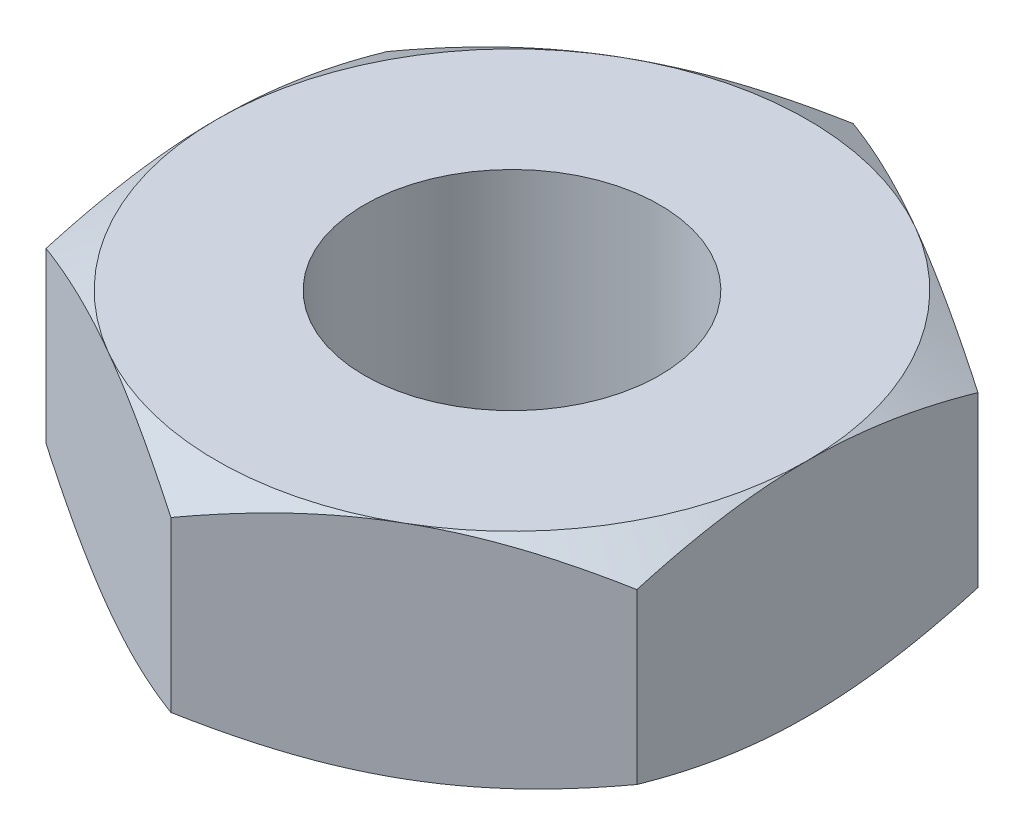
ISO-10303-21;
HEADER;
FILE_DESCRIPTION(('STEP AP214'),'2;1');
FILE_NAME('part.step','',(''),(''),'','','');
FILE_SCHEMA(('AUTOMOTIVE_DESIGN { 1 0 10303 214 1 1 1 1 }'));
ENDSEC;
DATA;
#1=APPLICATION_CONTEXT('core data for automotive mechanical design processes');
#2=APPLICATION_PROTOCOL_DEFINITION('international standard','automotive_design',2000,#1);
#3=PRODUCT_CONTEXT('',#1,'mechanical');
#4=PRODUCT('Part','Part','',(#3));
#5=PRODUCT_RELATED_PRODUCT_CATEGORY('part','',(#4));
#6=PRODUCT_DEFINITION_FORMATION('','',#4);
#7=PRODUCT_DEFINITION_CONTEXT('part definition',#1,'design');
#8=PRODUCT_DEFINITION('design','',#6,#7);
#9=PRODUCT_DEFINITION_SHAPE('','',#8);
#10=(LENGTH_UNIT() NAMED_UNIT(*) SI_UNIT(.MILLI.,.METRE.));
#11=(NAMED_UNIT(*) PLANE_ANGLE_UNIT() SI_UNIT($,.RADIAN.));
#12=(NAMED_UNIT(*) SI_UNIT($,.STERADIAN.) SOLID_ANGLE_UNIT());
#13=UNCERTAINTY_MEASURE_WITH_UNIT(LENGTH_MEASURE(1.E-05),#10,'distance_accuracy_value','');
#14=(GEOMETRIC_REPRESENTATION_CONTEXT(3) GLOBAL_UNCERTAINTY_ASSIGNED_CONTEXT((#13)) GLOBAL_UNIT_ASSIGNED_CONTEXT((#10,
#11,#12)) REPRESENTATION_CONTEXT('',''));
#15=CARTESIAN_POINT('',(0.,0.,0.));
#16=DIRECTION('',(0.,0.,1.));
#17=DIRECTION('',(1.,0.,0.));
#18=AXIS2_PLACEMENT_3D('',#15,#16,#17);
#19=CARTESIAN_POINT('',(-2.,1.5,1.15470053837925));
#20=DIRECTION('',(0.5,0.,-0.866025403784439));
#21=DIRECTION('',(-0.866025403784439,0.,-0.5));
#22=AXIS2_PLACEMENT_3D('',#19,#20,#21);
#23=PLANE('',#22);
#24=CARTESIAN_POINT('',(0.000200000000000871,0.178699466620498,2.30951654681234));
#25=CARTESIAN_POINT('',(-0.0876912629000591,0.149389536100679,2.25877250251758));
#26=CARTESIAN_POINT('',(-0.17634119447359,0.122732851980467,2.20759044065996));
#27=CARTESIAN_POINT('',(-0.355176246997801,0.0762024910207211,2.10433997494456));
#28=CARTESIAN_POINT('',(-0.445364546505036,0.0563452763827791,2.05226973594631));
#29=CARTESIAN_POINT('',(-0.624623385763305,0.0254334640232527,1.94877459684592));
#30=CARTESIAN_POINT('',(-0.713666338226303,0.0141731515985314,1.89736562427197));
#31=CARTESIAN_POINT('',(-0.892171397785042,0.000728662594642178,1.79430568008402));
#32=CARTESIAN_POINT('',(-0.981632855703957,-0.00146664504653163,1.74265508327244));
#33=CARTESIAN_POINT('',(-1.1488083535488,0.00309098933064886,1.64613626458981));
#34=CARTESIAN_POINT('',(-1.22654737026578,0.00872487468701465,1.60125362236173));
#35=CARTESIAN_POINT('',(-1.38151891453613,0.0265838952608284,1.51178075956051));
#36=CARTESIAN_POINT('',(-1.4587509057412,0.0388151360234394,1.46719084864821));
#37=CARTESIAN_POINT('',(-1.6140421864822,0.0693934368676098,1.37753338590959));
#38=CARTESIAN_POINT('',(-1.69208181310738,0.0878701670657158,1.33247718647009));
#39=CARTESIAN_POINT('',(-1.84699686569213,0.129805518212856,1.24303693915875));
#40=CARTESIAN_POINT('',(-1.92387427762312,0.153254280492313,1.1986517446858));
#41=CARTESIAN_POINT('',(-2.0002,0.178699466620498,1.15458506832541));
#42=B_SPLINE_CURVE_WITH_KNOTS('',3,(#24,#25,#26,#27,#28,#29,#30,#31,#32,#33,#34,#35,#36,#37,#38,
#39,#40,#41),.UNSPECIFIED.,.F.,.F.,(4,2,2,2,2,2,2,2,4),(0.,0.31703182469561,0.634825876346563,
0.944753967652636,1.25430138000371,1.52387047293094,1.79368946861028,2.06949491027634,
2.34475850821472),.UNSPECIFIED.);
#43=CARTESIAN_POINT('',(0.,0.178632794954081,2.3094010767585));
#44=VERTEX_POINT('',#43);
#45=CARTESIAN_POINT('',(-1.,0.,1.73205080756888));
#46=VERTEX_POINT('',#45);
#47=EDGE_CURVE('E143',#44,#46,#42,.T.);
#48=ORIENTED_EDGE('',*,*,#47,.F.);
#49=DIRECTION('',(0.,-1.,0.));
#50=VECTOR('',#49,1.);
#51=CARTESIAN_POINT('',(0.,1.5,2.3094010767585));
#52=LINE('',#51,#50);
#53=CARTESIAN_POINT('',(0.,1.32136720504592,2.3094010767585));
#54=VERTEX_POINT('',#53);
#55=EDGE_CURVE('E155',#54,#44,#52,.T.);
#56=ORIENTED_EDGE('',*,*,#55,.F.);
#57=CARTESIAN_POINT('',(-2.0002,1.3213005333795,1.15458506832541));
#58=CARTESIAN_POINT('',(-1.91230873709994,1.35061046389932,1.20532911262018));
#59=CARTESIAN_POINT('',(-1.82365880552641,1.37726714801953,1.2565111744778));
#60=CARTESIAN_POINT('',(-1.6448237530022,1.42379750897928,1.35976164019319));
#61=CARTESIAN_POINT('',(-1.55463545349496,1.44365472361722,1.41183187919145));
#62=CARTESIAN_POINT('',(-1.37537661423669,1.47456653597675,1.51532701829183));
#63=CARTESIAN_POINT('',(-1.2863336617737,1.48582684840147,1.56673599086578));
#64=CARTESIAN_POINT('',(-1.10782860221496,1.49927133740536,1.66979593505373));
#65=CARTESIAN_POINT('',(-1.01836714429604,1.50146664504653,1.72144653186531));
#66=CARTESIAN_POINT('',(-0.851191646451202,1.49690901066935,1.81796535054794));
#67=CARTESIAN_POINT('',(-0.773452629734216,1.49127512531299,1.86284799277603));
#68=CARTESIAN_POINT('',(-0.618481085463867,1.47341610473917,1.95232085557725));
#69=CARTESIAN_POINT('',(-0.541249094258801,1.46118486397656,1.99691076648954));
#70=CARTESIAN_POINT('',(-0.385957813517799,1.43060656313239,2.08656822922816));
#71=CARTESIAN_POINT('',(-0.30791818689262,1.41212983293428,2.13162442866767));
#72=CARTESIAN_POINT('',(-0.153003134307864,1.37019448178714,2.221064675979));
#73=CARTESIAN_POINT('',(-0.076125722376879,1.34674571950769,2.26544987045196));
#74=CARTESIAN_POINT('',(0.00020000000000098,1.3213005333795,2.30951654681234));
#75=B_SPLINE_CURVE_WITH_KNOTS('',3,(#57,#58,#59,#60,#61,#62,#63,#64,#65,#66,#67,#68,#69,#70,#71,
#72,#73,#74),.UNSPECIFIED.,.F.,.F.,(4,2,2,2,2,2,2,2,4),(0.,0.31703182469561,0.634825876346564,
0.944753967652636,1.25430138000371,1.52387047293094,1.79368946861028,2.06949491027634,
2.34475850821472),.UNSPECIFIED.);
#76=CARTESIAN_POINT('',(-1.,1.5,1.73205080756888));
#77=VERTEX_POINT('',#76);
#78=EDGE_CURVE('E315',#77,#54,#75,.T.);
#79=ORIENTED_EDGE('',*,*,#78,.F.);
#80=CARTESIAN_POINT('',(-2.,1.32136720504593,1.15470053837926));
#81=VERTEX_POINT('',#80);
#82=EDGE_CURVE('E307',#81,#77,#75,.T.);
#83=ORIENTED_EDGE('',*,*,#82,.F.);
#84=DIRECTION('',(0.,-1.,0.));
#85=VECTOR('',#84,1.);
#86=CARTESIAN_POINT('',(-2.,1.5,1.15470053837925));
#87=LINE('',#86,#85);
#88=CARTESIAN_POINT('',(-2.,0.178632794954081,1.15470053837925));
#89=VERTEX_POINT('',#88);
#90=EDGE_CURVE('E240',#81,#89,#87,.T.);
#91=ORIENTED_EDGE('',*,*,#90,.T.);
#92=EDGE_CURVE('E206',#46,#89,#42,.T.);
#93=ORIENTED_EDGE('',*,*,#92,.F.);
#94=EDGE_LOOP('',(#48,#56,#79,#83,#91,#93));
#95=FACE_BOUND('',#94,.T.);
#96=ADVANCED_FACE('F35',(#95),#23,.F.);
#97=CARTESIAN_POINT('',(0.,1.5,2.3094010767585));
#98=DIRECTION('',(-0.5,0.,-0.866025403784439));
#99=DIRECTION('',(-0.866025403784439,0.,0.5));
#100=AXIS2_PLACEMENT_3D('',#97,#98,#99);
#101=PLANE('',#100);
#102=CARTESIAN_POINT('',(2.0002,0.178699466620498,1.15458506832541));
#103=CARTESIAN_POINT('',(1.91230873709994,0.149389536100679,1.20532911262018));
#104=CARTESIAN_POINT('',(1.82365880552641,0.122732851980467,1.2565111744778));
#105=CARTESIAN_POINT('',(1.6448237530022,0.0762024910207213,1.35976164019319));
#106=CARTESIAN_POINT('',(1.55463545349496,0.0563452763827795,1.41183187919145));
#107=CARTESIAN_POINT('',(1.37537661423669,0.025433464023253,1.51532701829183));
#108=CARTESIAN_POINT('',(1.2863336617737,0.0141731515985316,1.56673599086578));
#109=CARTESIAN_POINT('',(1.10782860221496,0.000728662594642367,1.66979593505373));
#110=CARTESIAN_POINT('',(1.01836714429604,-0.00146664504653124,1.72144653186531));
#111=CARTESIAN_POINT('',(0.851191646451202,0.00309098933064935,1.81796535054794));
#112=CARTESIAN_POINT('',(0.773452629734216,0.00872487468701508,1.86284799277603));
#113=CARTESIAN_POINT('',(0.618481085463867,0.0265838952608287,1.95232085557725));
#114=CARTESIAN_POINT('',(0.541249094258802,0.0388151360234396,1.99691076648954));
#115=CARTESIAN_POINT('',(0.385957813517799,0.0693934368676101,2.08656822922816));
#116=CARTESIAN_POINT('',(0.307918186892621,0.0878701670657163,2.13162442866767));
#117=CARTESIAN_POINT('',(0.153003134307866,0.129805518212856,2.221064675979));
#118=CARTESIAN_POINT('',(0.0761257223768805,0.153254280492314,2.26544987045196));
#119=CARTESIAN_POINT('',(-0.000199999999999435,0.178699466620498,2.30951654681234));
#120=B_SPLINE_CURVE_WITH_KNOTS('',3,(#102,#103,#104,#105,#106,#107,#108,#109,#110,#111,#112,
#113,#114,#115,#116,#117,#118,#119),.UNSPECIFIED.,.F.,.F.,(4,2,2,2,2,2,2,2,4),(0.,
0.31703182469561,0.634825876346563,0.944753967652636,1.25430138000371,1.52387047293094,
1.79368946861028,2.06949491027634,2.34475850821472),.UNSPECIFIED.);
#121=CARTESIAN_POINT('',(2.,0.178632794954081,1.15470053837925));
#122=VERTEX_POINT('',#121);
#123=CARTESIAN_POINT('',(1.,0.,1.73205080756888));
#124=VERTEX_POINT('',#123);
#125=EDGE_CURVE('E124',#122,#124,#120,.T.);
#126=ORIENTED_EDGE('',*,*,#125,.F.);
#127=DIRECTION('',(0.,-1.,0.));
#128=VECTOR('',#127,1.);
#129=CARTESIAN_POINT('',(2.,1.5,1.15470053837925));
#130=LINE('',#129,#128);
#131=CARTESIAN_POINT('',(2.,1.32136720504592,1.15470053837925));
#132=VERTEX_POINT('',#131);
#133=EDGE_CURVE('E237',#132,#122,#130,.T.);
#134=ORIENTED_EDGE('',*,*,#133,.F.);
#135=CARTESIAN_POINT('',(-0.000199999999999203,1.3213005333795,2.30951654681234));
#136=CARTESIAN_POINT('',(0.0876912629000609,1.35061046389932,2.25877250251758));
#137=CARTESIAN_POINT('',(0.176341194473592,1.37726714801953,2.20759044065996));
#138=CARTESIAN_POINT('',(0.355176246997803,1.42379750897928,2.10433997494456));
#139=CARTESIAN_POINT('',(0.445364546505037,1.44365472361722,2.0522697359463));
#140=CARTESIAN_POINT('',(0.624623385763307,1.47456653597675,1.94877459684592));
#141=CARTESIAN_POINT('',(0.713666338226305,1.48582684840147,1.89736562427197));
#142=CARTESIAN_POINT('',(0.892171397785044,1.49927133740536,1.79430568008402));
#143=CARTESIAN_POINT('',(0.981632855703959,1.50146664504653,1.74265508327244));
#144=CARTESIAN_POINT('',(1.1488083535488,1.49690901066935,1.64613626458981));
#145=CARTESIAN_POINT('',(1.22654737026578,1.49127512531299,1.60125362236173));
#146=CARTESIAN_POINT('',(1.38151891453613,1.47341610473917,1.51178075956051));
#147=CARTESIAN_POINT('',(1.4587509057412,1.46118486397656,1.46719084864821));
#148=CARTESIAN_POINT('',(1.6140421864822,1.43060656313239,1.37753338590959));
#149=CARTESIAN_POINT('',(1.69208181310738,1.41212983293428,1.33247718647009));
#150=CARTESIAN_POINT('',(1.84699686569214,1.37019448178714,1.24303693915875));
#151=CARTESIAN_POINT('',(1.92387427762312,1.34674571950769,1.1986517446858));
#152=CARTESIAN_POINT('',(2.0002,1.3213005333795,1.15458506832541));
#153=B_SPLINE_CURVE_WITH_KNOTS('',3,(#135,#136,#137,#138,#139,#140,#141,#142,#143,#144,#145,
#146,#147,#148,#149,#150,#151,#152),.UNSPECIFIED.,.F.,.F.,(4,2,2,2,2,2,2,2,4),(0.,
0.31703182469561,0.634825876346563,0.944753967652635,1.25430138000371,1.52387047293094,
1.79368946861028,2.06949491027634,2.34475850821472),.UNSPECIFIED.);
#154=CARTESIAN_POINT('',(1.,1.5,1.73205080756888));
#155=VERTEX_POINT('',#154);
#156=EDGE_CURVE('E283',#155,#132,#153,.T.);
#157=ORIENTED_EDGE('',*,*,#156,.F.);
#158=EDGE_CURVE('E320',#54,#155,#153,.T.);
#159=ORIENTED_EDGE('',*,*,#158,.F.);
#160=ORIENTED_EDGE('',*,*,#55,.T.);
#161=EDGE_CURVE('E136',#124,#44,#120,.T.);
#162=ORIENTED_EDGE('',*,*,#161,.F.);
#163=EDGE_LOOP('',(#126,#134,#157,#159,#160,#162));
#164=FACE_BOUND('',#163,.T.);
#165=ADVANCED_FACE('F152',(#164),#101,.F.);
#166=CARTESIAN_POINT('',(2.,1.5,1.15470053837925));
#167=DIRECTION('',(-1.,0.,0.));
#168=DIRECTION('',(0.,0.,1.));
#169=AXIS2_PLACEMENT_3D('',#166,#167,#168);
#170=PLANE('',#169);
#171=CARTESIAN_POINT('',(2.,1.38024356206322,-3.9086858120223));
#172=CARTESIAN_POINT('',(2.,1.33338477520942,-3.81751112169324));
#173=CARTESIAN_POINT('',(2.,1.28679021631781,-3.72620145046507));
#174=CARTESIAN_POINT('',(2.,1.19424910626193,-3.54325228824929));
#175=CARTESIAN_POINT('',(2.,1.14830256761152,-3.45161279093522));
#176=CARTESIAN_POINT('',(2.,1.01146715761723,-3.17581300243889));
#177=CARTESIAN_POINT('',(2.,0.921737415753043,-2.9910709203634));
#178=CARTESIAN_POINT('',(2.,0.788409395654004,-2.70743624323685));
#179=CARTESIAN_POINT('',(2.,0.743100656319978,-2.60934831774002));
#180=CARTESIAN_POINT('',(2.,0.654163775473776,-2.41241507533712));
#181=CARTESIAN_POINT('',(2.,0.610535569794256,-2.31356978752232));
#182=CARTESIAN_POINT('',(2.,0.525465312630819,-2.11501734395706));
#183=CARTESIAN_POINT('',(2.,0.484021797433511,-2.0153108187193));
#184=CARTESIAN_POINT('',(2.,0.403937006613858,-1.81474539793162));
#185=CARTESIAN_POINT('',(2.,0.365296392668009,-1.71388623674348));
#186=CARTESIAN_POINT('',(2.,0.285617620657406,-1.49400593807688));
#187=CARTESIAN_POINT('',(2.,0.245241020544741,-1.37474151517002));
#188=CARTESIAN_POINT('',(2.,0.171425178991217,-1.13410850020832));
#189=CARTESIAN_POINT('',(2.,0.137982386760639,-1.0127410198025));
#190=CARTESIAN_POINT('',(2.,0.0810163135177482,-0.770071934944817));
#191=CARTESIAN_POINT('',(2.,0.05731644498316,-0.648812992268316));
#192=CARTESIAN_POINT('',(2.,0.0214266196550796,-0.404608758962328));
#193=CARTESIAN_POINT('',(2.,0.00922997508793481,-0.281664490388411));
#194=CARTESIAN_POINT('',(2.,-0.00207085477321442,-0.0335419748269816));
#195=CARTESIAN_POINT('',(2.,-0.00100267071105186,0.0916445286709641));
#196=CARTESIAN_POINT('',(2.,0.0144840452379088,0.341193409529));
#197=CARTESIAN_POINT('',(2.,0.0289073543713881,0.465555475947226));
#198=CARTESIAN_POINT('',(2.,0.0695474304125028,0.714833183390077));
#199=CARTESIAN_POINT('',(2.,0.0959955839540991,0.83970964218488));
#200=CARTESIAN_POINT('',(2.,0.157986894429597,1.08715459095749));
#201=CARTESIAN_POINT('',(2.,0.193532661864587,1.20972240762972));
#202=CARTESIAN_POINT('',(2.,0.269280519283634,1.44650470413582));
#203=CARTESIAN_POINT('',(2.,0.309153182000627,1.56082665519536));
#204=CARTESIAN_POINT('',(2.,0.393292544621002,1.78785420479763));
#205=CARTESIAN_POINT('',(2.,0.437560254612616,1.90055942493322));
#206=CARTESIAN_POINT('',(2.,0.529372373860236,2.12474648121528));
#207=CARTESIAN_POINT('',(2.,0.576919977737398,2.23622699843601));
#208=CARTESIAN_POINT('',(2.,0.67443498494533,2.45812606854002));
#209=CARTESIAN_POINT('',(2.,0.724402516378927,2.56854456483181));
#210=CARTESIAN_POINT('',(2.,0.823331957292792,2.78238975570627));
#211=CARTESIAN_POINT('',(2.,0.872194314459439,2.88586269009034));
#212=CARTESIAN_POINT('',(2.,0.971202074310625,3.09219555395058));
#213=CARTESIAN_POINT('',(2.,1.02134751719606,3.19505546409504));
#214=CARTESIAN_POINT('',(2.,1.12249261908677,3.39994809054478));
#215=CARTESIAN_POINT('',(2.,1.1734890679984,3.50198239517474));
#216=CARTESIAN_POINT('',(2.,1.27629914354312,3.70562803087648));
#217=CARTESIAN_POINT('',(2.,1.32811270118693,3.80723939675145));
#218=CARTESIAN_POINT('',(2.,1.38024356206323,3.9086858120223));
#219=B_SPLINE_CURVE_WITH_KNOTS('',3,(#171,#172,#173,#174,#175,#176,#177,#178,#179,#180,#181,
#182,#183,#184,#185,#186,#187,#188,#189,#190,#191,#192,#193,#194,#195,#196,#197,#198,#199,#200,
#201,#202,#203,#204,#205,#206,#207,#208,#209,#210,#211,#212,#213,#214,#215,#216,#217,#218),
.UNSPECIFIED.,.F.,.F.,(4,2,2,2,2,2,2,2,2,2,2,2,2,2,2,2,2,2,2,2,2,2,2,4),(0.,0.307531563856155,
0.615069058317578,1.23115557383005,1.55528461857819,1.8794012749051,2.2032979430231,
2.52727082574405,2.9048604545366,3.28225624019068,3.65247322929853,4.02247484779028,
4.39728941630346,4.77223811112903,5.15472880172826,5.53732936883045,5.90044039858863,
6.26363507408059,6.62718863760779,6.99076146751935,7.33404016464889,7.67732963038956,
8.01953135999518,8.36170435024385),.UNSPECIFIED.);
#220=CARTESIAN_POINT('',(2.,0.178632794954081,-1.15470053837925));
#221=VERTEX_POINT('',#220);
#222=CARTESIAN_POINT('',(2.,0.,0.));
#223=VERTEX_POINT('',#222);
#224=EDGE_CURVE('E51',#221,#223,#219,.T.);
#225=ORIENTED_EDGE('',*,*,#224,.F.);
#226=DIRECTION('',(0.,-1.,0.));
#227=VECTOR('',#226,1.);
#228=CARTESIAN_POINT('',(2.,1.5,-1.15470053837925));
#229=LINE('',#228,#227);
#230=CARTESIAN_POINT('',(2.,1.32136720504592,-1.15470053837925));
#231=VERTEX_POINT('',#230);
#232=EDGE_CURVE('E234',#231,#221,#229,.T.);
#233=ORIENTED_EDGE('',*,*,#232,.F.);
#234=CARTESIAN_POINT('',(2.,0.119756437936775,3.9086858120223));
#235=CARTESIAN_POINT('',(2.,0.166615224790584,3.81751112169324));
#236=CARTESIAN_POINT('',(2.,0.213209783682193,3.72620145046507));
#237=CARTESIAN_POINT('',(2.,0.305750893738074,3.54325228824929));
#238=CARTESIAN_POINT('',(2.,0.351697432388484,3.45161279093522));
#239=CARTESIAN_POINT('',(2.,0.488532842382774,3.17581300243889));
#240=CARTESIAN_POINT('',(2.,0.578262584246956,2.9910709203634));
#241=CARTESIAN_POINT('',(2.,0.711590604345995,2.70743624323685));
#242=CARTESIAN_POINT('',(2.,0.756899343680022,2.60934831774002));
#243=CARTESIAN_POINT('',(2.,0.845836224526223,2.41241507533712));
#244=CARTESIAN_POINT('',(2.,0.889464430205743,2.31356978752232));
#245=CARTESIAN_POINT('',(2.,0.974534687369181,2.11501734395706));
#246=CARTESIAN_POINT('',(2.,1.01597820256649,2.0153108187193));
#247=CARTESIAN_POINT('',(2.,1.09606299338614,1.81474539793162));
#248=CARTESIAN_POINT('',(2.,1.13470360733199,1.71388623674348));
#249=CARTESIAN_POINT('',(2.,1.21438237934259,1.49400593807688));
#250=CARTESIAN_POINT('',(2.,1.25475897945526,1.37474151517002));
#251=CARTESIAN_POINT('',(2.,1.32857482100878,1.13410850020832));
#252=CARTESIAN_POINT('',(2.,1.36201761323936,1.0127410198025));
#253=CARTESIAN_POINT('',(2.,1.41898368648225,0.770071934944817));
#254=CARTESIAN_POINT('',(2.,1.44268355501684,0.648812992268316));
#255=CARTESIAN_POINT('',(2.,1.47857338034492,0.404608758962328));
#256=CARTESIAN_POINT('',(2.,1.49077002491207,0.281664490388411));
#257=CARTESIAN_POINT('',(2.,1.50207085477321,0.033541974826982));
#258=CARTESIAN_POINT('',(2.,1.50100267071105,-0.0916445286709635));
#259=CARTESIAN_POINT('',(2.,1.48551595476209,-0.341193409528999));
#260=CARTESIAN_POINT('',(2.,1.47109264562861,-0.465555475947226));
#261=CARTESIAN_POINT('',(2.,1.4304525695875,-0.714833183390076));
#262=CARTESIAN_POINT('',(2.,1.4040044160459,-0.83970964218488));
#263=CARTESIAN_POINT('',(2.,1.3420131055704,-1.08715459095749));
#264=CARTESIAN_POINT('',(2.,1.30646733813541,-1.20972240762972));
#265=CARTESIAN_POINT('',(2.,1.23071948071637,-1.44650470413582));
#266=CARTESIAN_POINT('',(2.,1.19084681799937,-1.56082665519536));
#267=CARTESIAN_POINT('',(2.,1.106707455379,-1.78785420479763));
#268=CARTESIAN_POINT('',(2.,1.06243974538738,-1.90055942493322));
#269=CARTESIAN_POINT('',(2.,0.970627626139765,-2.12474648121528));
#270=CARTESIAN_POINT('',(2.,0.923080022262602,-2.23622699843601));
#271=CARTESIAN_POINT('',(2.,0.82556501505467,-2.45812606854002));
#272=CARTESIAN_POINT('',(2.,0.775597483621073,-2.56854456483181));
#273=CARTESIAN_POINT('',(2.,0.676668042707208,-2.78238975570627));
#274=CARTESIAN_POINT('',(2.,0.627805685540561,-2.88586269009034));
#275=CARTESIAN_POINT('',(2.,0.528797925689376,-3.09219555395058));
#276=CARTESIAN_POINT('',(2.,0.478652482803938,-3.19505546409504));
#277=CARTESIAN_POINT('',(2.,0.377507380913227,-3.39994809054478));
#278=CARTESIAN_POINT('',(2.,0.326510932001602,-3.50198239517474));
#279=CARTESIAN_POINT('',(2.,0.223700856456886,-3.70562803087648));
#280=CARTESIAN_POINT('',(2.,0.17188729881307,-3.80723939675145));
#281=CARTESIAN_POINT('',(2.,0.119756437936776,-3.9086858120223));
#282=B_SPLINE_CURVE_WITH_KNOTS('',3,(#234,#235,#236,#237,#238,#239,#240,#241,#242,#243,#244,
#245,#246,#247,#248,#249,#250,#251,#252,#253,#254,#255,#256,#257,#258,#259,#260,#261,#262,#263,
#264,#265,#266,#267,#268,#269,#270,#271,#272,#273,#274,#275,#276,#277,#278,#279,#280,#281),
.UNSPECIFIED.,.F.,.F.,(4,2,2,2,2,2,2,2,2,2,2,2,2,2,2,2,2,2,2,2,2,2,2,4),(0.,0.307531563856155,
0.615069058317577,1.23115557383005,1.55528461857819,1.8794012749051,2.20329794302309,
2.52727082574405,2.9048604545366,3.28225624019068,3.65247322929853,4.02247484779028,
4.39728941630346,4.77223811112902,5.15472880172826,5.53732936883045,5.90044039858862,
6.26363507408059,6.62718863760779,6.99076146751934,7.33404016464889,7.67732963038956,
8.01953135999517,8.36170435024385),.UNSPECIFIED.);
#283=CARTESIAN_POINT('',(2.,1.5,0.));
#284=VERTEX_POINT('',#283);
#285=EDGE_CURVE('E276',#284,#231,#282,.T.);
#286=ORIENTED_EDGE('',*,*,#285,.F.);
#287=EDGE_CURVE('E282',#132,#284,#282,.T.);
#288=ORIENTED_EDGE('',*,*,#287,.F.);
#289=ORIENTED_EDGE('',*,*,#133,.T.);
#290=EDGE_CURVE('E130',#223,#122,#219,.T.);
#291=ORIENTED_EDGE('',*,*,#290,.F.);
#292=EDGE_LOOP('',(#225,#233,#286,#288,#289,#291));
#293=FACE_BOUND('',#292,.T.);
#294=ADVANCED_FACE('F289',(#293),#170,.F.);
#295=CARTESIAN_POINT('',(2.,1.5,-1.15470053837925));
#296=DIRECTION('',(-0.5,0.,0.866025403784439));
#297=DIRECTION('',(0.866025403784439,0.,0.5));
#298=AXIS2_PLACEMENT_3D('',#295,#296,#297);
#299=PLANE('',#298);
#300=CARTESIAN_POINT('',(-0.000200000000000425,0.178699466620497,-2.30951654681234));
#301=CARTESIAN_POINT('',(0.0876912629000599,0.149389536100679,-2.25877250251757));
#302=CARTESIAN_POINT('',(0.176341194473591,0.122732851980467,-2.20759044065995));
#303=CARTESIAN_POINT('',(0.355176246997802,0.0762024910207208,-2.10433997494456));
#304=CARTESIAN_POINT('',(0.445364546505036,0.0563452763827789,-2.0522697359463));
#305=CARTESIAN_POINT('',(0.624623385763306,0.0254334640232524,-1.94877459684592));
#306=CARTESIAN_POINT('',(0.713666338226304,0.0141731515985312,-1.89736562427197));
#307=CARTESIAN_POINT('',(0.892171397785043,0.000728662594642122,-1.79430568008402));
#308=CARTESIAN_POINT('',(0.981632855703957,-0.00146664504653161,-1.74265508327244));
#309=CARTESIAN_POINT('',(1.1488083535488,0.00309098933064879,-1.64613626458981));
#310=CARTESIAN_POINT('',(1.22654737026578,0.00872487468701445,-1.60125362236173));
#311=CARTESIAN_POINT('',(1.38151891453613,0.0265838952608282,-1.51178075956051));
#312=CARTESIAN_POINT('',(1.4587509057412,0.0388151360234393,-1.46719084864821));
#313=CARTESIAN_POINT('',(1.6140421864822,0.0693934368676098,-1.37753338590959));
#314=CARTESIAN_POINT('',(1.69208181310738,0.0878701670657158,-1.33247718647009));
#315=CARTESIAN_POINT('',(1.84699686569213,0.129805518212856,-1.24303693915875));
#316=CARTESIAN_POINT('',(1.92387427762312,0.153254280492313,-1.1986517446858));
#317=CARTESIAN_POINT('',(2.0002,0.178699466620497,-1.15458506832541));
#318=B_SPLINE_CURVE_WITH_KNOTS('',3,(#300,#301,#302,#303,#304,#305,#306,#307,#308,#309,#310,
#311,#312,#313,#314,#315,#316,#317),.UNSPECIFIED.,.F.,.F.,(4,2,2,2,2,2,2,2,4),(0.,
0.31703182469561,0.634825876346563,0.944753967652636,1.25430138000371,1.52387047293094,
1.79368946861028,2.06949491027634,2.34475850821472),.UNSPECIFIED.);
#319=CARTESIAN_POINT('',(0.,0.17863279495408,-2.3094010767585));
#320=VERTEX_POINT('',#319);
#321=CARTESIAN_POINT('',(0.999999999999999,0.,-1.73205080756888));
#322=VERTEX_POINT('',#321);
#323=EDGE_CURVE('E58',#320,#322,#318,.T.);
#324=ORIENTED_EDGE('',*,*,#323,.F.);
#325=DIRECTION('',(0.,-1.,0.));
#326=VECTOR('',#325,1.);
#327=CARTESIAN_POINT('',(0.,1.5,-2.3094010767585));
#328=LINE('',#327,#326);
#329=CARTESIAN_POINT('',(0.,1.32136720504592,-2.3094010767585));
#330=VERTEX_POINT('',#329);
#331=EDGE_CURVE('E227',#330,#320,#328,.T.);
#332=ORIENTED_EDGE('',*,*,#331,.F.);
#333=CARTESIAN_POINT('',(2.0002,1.3213005333795,-1.15458506832541));
#334=CARTESIAN_POINT('',(1.91230873709994,1.35061046389932,-1.20532911262018));
#335=CARTESIAN_POINT('',(1.82365880552641,1.37726714801953,-1.2565111744778));
#336=CARTESIAN_POINT('',(1.6448237530022,1.42379750897928,-1.35976164019319));
#337=CARTESIAN_POINT('',(1.55463545349496,1.44365472361722,-1.41183187919145));
#338=CARTESIAN_POINT('',(1.37537661423669,1.47456653597675,-1.51532701829183));
#339=CARTESIAN_POINT('',(1.2863336617737,1.48582684840147,-1.56673599086578));
#340=CARTESIAN_POINT('',(1.10782860221496,1.49927133740536,-1.66979593505373));
#341=CARTESIAN_POINT('',(1.01836714429604,1.50146664504653,-1.72144653186531));
#342=CARTESIAN_POINT('',(0.851191646451201,1.49690901066935,-1.81796535054794));
#343=CARTESIAN_POINT('',(0.773452629734216,1.49127512531299,-1.86284799277603));
#344=CARTESIAN_POINT('',(0.618481085463866,1.47341610473917,-1.95232085557725));
#345=CARTESIAN_POINT('',(0.541249094258801,1.46118486397656,-1.99691076648954));
#346=CARTESIAN_POINT('',(0.385957813517799,1.43060656313239,-2.08656822922816));
#347=CARTESIAN_POINT('',(0.30791818689262,1.41212983293428,-2.13162442866767));
#348=CARTESIAN_POINT('',(0.153003134307865,1.37019448178714,-2.221064675979));
#349=CARTESIAN_POINT('',(0.0761257223768797,1.34674571950769,-2.26544987045196));
#350=CARTESIAN_POINT('',(-0.000200000000000532,1.3213005333795,-2.30951654681234));
#351=B_SPLINE_CURVE_WITH_KNOTS('',3,(#333,#334,#335,#336,#337,#338,#339,#340,#341,#342,#343,
#344,#345,#346,#347,#348,#349,#350),.UNSPECIFIED.,.F.,.F.,(4,2,2,2,2,2,2,2,4),(0.,
0.31703182469561,0.634825876346563,0.944753967652636,1.25430138000371,1.52387047293094,
1.79368946861028,2.06949491027634,2.34475850821472),.UNSPECIFIED.);
#352=CARTESIAN_POINT('',(0.999999999999999,1.5,-1.73205080756888));
#353=VERTEX_POINT('',#352);
#354=EDGE_CURVE('E269',#353,#330,#351,.T.);
#355=ORIENTED_EDGE('',*,*,#354,.F.);
#356=EDGE_CURVE('E275',#231,#353,#351,.T.);
#357=ORIENTED_EDGE('',*,*,#356,.F.);
#358=ORIENTED_EDGE('',*,*,#232,.T.);
#359=EDGE_CURVE('E135',#322,#221,#318,.T.);
#360=ORIENTED_EDGE('',*,*,#359,.F.);
#361=EDGE_LOOP('',(#324,#332,#355,#357,#358,#360));
#362=FACE_BOUND('',#361,.T.);
#363=ADVANCED_FACE('F225',(#362),#299,.F.);
#364=CARTESIAN_POINT('',(0.,1.5,-2.3094010767585));
#365=DIRECTION('',(0.5,0.,0.866025403784439));
#366=DIRECTION('',(0.866025403784439,0.,-0.5));
#367=AXIS2_PLACEMENT_3D('',#364,#365,#366);
#368=PLANE('',#367);
#369=CARTESIAN_POINT('',(-2.0002,0.178699466620498,-1.15458506832541));
#370=CARTESIAN_POINT('',(-1.91230873709994,0.149389536100679,-1.20532911262018));
#371=CARTESIAN_POINT('',(-1.82365880552641,0.122732851980467,-1.2565111744778));
#372=CARTESIAN_POINT('',(-1.6448237530022,0.0762024910207211,-1.35976164019319));
#373=CARTESIAN_POINT('',(-1.55463545349496,0.0563452763827792,-1.41183187919145));
#374=CARTESIAN_POINT('',(-1.37537661423669,0.0254334640232525,-1.51532701829183));
#375=CARTESIAN_POINT('',(-1.2863336617737,0.0141731515985311,-1.56673599086578));
#376=CARTESIAN_POINT('',(-1.10782860221496,0.000728662594641959,-1.66979593505373));
#377=CARTESIAN_POINT('',(-1.01836714429604,-0.00146664504653162,-1.72144653186531));
#378=CARTESIAN_POINT('',(-0.851191646451202,0.0030909893306488,-1.81796535054794));
#379=CARTESIAN_POINT('',(-0.773452629734217,0.00872487468701436,-1.86284799277603));
#380=CARTESIAN_POINT('',(-0.618481085463867,0.0265838952608281,-1.95232085557725));
#381=CARTESIAN_POINT('',(-0.541249094258802,0.0388151360234392,-1.99691076648954));
#382=CARTESIAN_POINT('',(-0.3859578135178,0.0693934368676098,-2.08656822922816));
#383=CARTESIAN_POINT('',(-0.307918186892621,0.0878701670657157,-2.13162442866767));
#384=CARTESIAN_POINT('',(-0.153003134307866,0.129805518212855,-2.221064675979));
#385=CARTESIAN_POINT('',(-0.0761257223768802,0.153254280492313,-2.26544987045196));
#386=CARTESIAN_POINT('',(0.000199999999999784,0.178699466620497,-2.30951654681234));
#387=B_SPLINE_CURVE_WITH_KNOTS('',3,(#369,#370,#371,#372,#373,#374,#375,#376,#377,#378,#379,
#380,#381,#382,#383,#384,#385,#386),.UNSPECIFIED.,.F.,.F.,(4,2,2,2,2,2,2,2,4),(0.,
0.31703182469561,0.634825876346563,0.944753967652636,1.25430138000371,1.52387047293094,
1.79368946861028,2.06949491027634,2.34475850821472),.UNSPECIFIED.);
#388=CARTESIAN_POINT('',(-2.,0.178632794954074,-1.15470053837926));
#389=VERTEX_POINT('',#388);
#390=CARTESIAN_POINT('',(-1.,0.,-1.73205080756888));
#391=VERTEX_POINT('',#390);
#392=EDGE_CURVE('E200',#389,#391,#387,.T.);
#393=ORIENTED_EDGE('',*,*,#392,.F.);
#394=DIRECTION('',(0.,-1.,0.));
#395=VECTOR('',#394,1.);
#396=CARTESIAN_POINT('',(-2.,1.5,-1.15470053837925));
#397=LINE('',#396,#395);
#398=CARTESIAN_POINT('',(-2.,1.32136720504592,-1.15470053837925));
#399=VERTEX_POINT('',#398);
#400=EDGE_CURVE('E235',#399,#389,#397,.T.);
#401=ORIENTED_EDGE('',*,*,#400,.F.);
#402=CARTESIAN_POINT('',(0.000199999999999613,1.3213005333795,-2.30951654681234));
#403=CARTESIAN_POINT('',(-0.0876912629000601,1.35061046389932,-2.25877250251757));
#404=CARTESIAN_POINT('',(-0.176341194473592,1.37726714801953,-2.20759044065995));
#405=CARTESIAN_POINT('',(-0.355176246997802,1.42379750897928,-2.10433997494456));
#406=CARTESIAN_POINT('',(-0.445364546505037,1.44365472361722,-2.0522697359463));
#407=CARTESIAN_POINT('',(-0.624623385763306,1.47456653597675,-1.94877459684592));
#408=CARTESIAN_POINT('',(-0.713666338226304,1.48582684840147,-1.89736562427197));
#409=CARTESIAN_POINT('',(-0.892171397785043,1.49927133740536,-1.79430568008402));
#410=CARTESIAN_POINT('',(-0.981632855703958,1.50146664504653,-1.74265508327244));
#411=CARTESIAN_POINT('',(-1.1488083535488,1.49690901066935,-1.64613626458981));
#412=CARTESIAN_POINT('',(-1.22654737026578,1.49127512531299,-1.60125362236172));
#413=CARTESIAN_POINT('',(-1.38151891453613,1.47341610473917,-1.51178075956051));
#414=CARTESIAN_POINT('',(-1.4587509057412,1.46118486397656,-1.46719084864821));
#415=CARTESIAN_POINT('',(-1.6140421864822,1.43060656313239,-1.37753338590959));
#416=CARTESIAN_POINT('',(-1.69208181310738,1.41212983293428,-1.33247718647009));
#417=CARTESIAN_POINT('',(-1.84699686569214,1.37019448178714,-1.24303693915875));
#418=CARTESIAN_POINT('',(-1.92387427762312,1.34674571950769,-1.1986517446858));
#419=CARTESIAN_POINT('',(-2.0002,1.3213005333795,-1.15458506832541));
#420=B_SPLINE_CURVE_WITH_KNOTS('',3,(#402,#403,#404,#405,#406,#407,#408,#409,#410,#411,#412,
#413,#414,#415,#416,#417,#418,#419),.UNSPECIFIED.,.F.,.F.,(4,2,2,2,2,2,2,2,4),(0.,
0.31703182469561,0.634825876346563,0.944753967652635,1.25430138000371,1.52387047293094,
1.79368946861028,2.06949491027634,2.34475850821472),.UNSPECIFIED.);
#421=CARTESIAN_POINT('',(-1.,1.5,-1.73205080756888));
#422=VERTEX_POINT('',#421);
#423=EDGE_CURVE('E262',#422,#399,#420,.T.);
#424=ORIENTED_EDGE('',*,*,#423,.F.);
#425=EDGE_CURVE('E233',#330,#422,#420,.T.);
#426=ORIENTED_EDGE('',*,*,#425,.F.);
#427=ORIENTED_EDGE('',*,*,#331,.T.);
#428=EDGE_CURVE('E156',#391,#320,#387,.T.);
#429=ORIENTED_EDGE('',*,*,#428,.F.);
#430=EDGE_LOOP('',(#393,#401,#424,#426,#427,#429));
#431=FACE_BOUND('',#430,.T.);
#432=ADVANCED_FACE('F230',(#431),#368,.F.);
#433=CARTESIAN_POINT('',(-2.,1.5,-1.15470053837925));
#434=DIRECTION('',(1.,0.,0.));
#435=DIRECTION('',(0.,0.,-1.));
#436=AXIS2_PLACEMENT_3D('',#433,#434,#435);
#437=PLANE('',#436);
#438=CARTESIAN_POINT('',(-2.,1.38024356206322,3.9086858120223));
#439=CARTESIAN_POINT('',(-2.,1.33338477520941,3.81751112169324));
#440=CARTESIAN_POINT('',(-2.,1.28679021631781,3.72620145046507));
#441=CARTESIAN_POINT('',(-2.,1.19424910626193,3.54325228824929));
#442=CARTESIAN_POINT('',(-2.,1.14830256761152,3.45161279093522));
#443=CARTESIAN_POINT('',(-2.,1.01146715761723,3.17581300243889));
#444=CARTESIAN_POINT('',(-2.,0.921737415753043,2.9910709203634));
#445=CARTESIAN_POINT('',(-2.,0.788409395654004,2.70743624323685));
#446=CARTESIAN_POINT('',(-2.,0.743100656319978,2.60934831774002));
#447=CARTESIAN_POINT('',(-2.,0.654163775473776,2.41241507533712));
#448=CARTESIAN_POINT('',(-2.,0.610535569794256,2.31356978752231));
#449=CARTESIAN_POINT('',(-2.,0.525465312630819,2.11501734395706));
#450=CARTESIAN_POINT('',(-2.,0.484021797433511,2.0153108187193));
#451=CARTESIAN_POINT('',(-2.,0.403937006613858,1.81474539793162));
#452=CARTESIAN_POINT('',(-2.,0.365296392668009,1.71388623674347));
#453=CARTESIAN_POINT('',(-2.,0.285617620657406,1.49400593807688));
#454=CARTESIAN_POINT('',(-2.,0.245241020544741,1.37474151517002));
#455=CARTESIAN_POINT('',(-2.,0.171425178991217,1.13410850020832));
#456=CARTESIAN_POINT('',(-2.,0.137982386760639,1.0127410198025));
#457=CARTESIAN_POINT('',(-2.,0.0810163135177484,0.770071934944815));
#458=CARTESIAN_POINT('',(-2.,0.0573164449831603,0.648812992268314));
#459=CARTESIAN_POINT('',(-2.,0.0214266196550801,0.404608758962327));
#460=CARTESIAN_POINT('',(-2.,0.00922997508793534,0.28166449038841));
#461=CARTESIAN_POINT('',(-2.,-0.00207085477321389,0.0335419748269802));
#462=CARTESIAN_POINT('',(-2.,-0.0010026707110514,-0.0916445286709655));
#463=CARTESIAN_POINT('',(-2.,0.0144840452379092,-0.341193409529001));
#464=CARTESIAN_POINT('',(-2.,0.0289073543713886,-0.465555475947227));
#465=CARTESIAN_POINT('',(-2.,0.0695474304125032,-0.714833183390078));
#466=CARTESIAN_POINT('',(-2.,0.0959955839540996,-0.839709642184882));
#467=CARTESIAN_POINT('',(-2.,0.157986894429598,-1.08715459095749));
#468=CARTESIAN_POINT('',(-2.,0.193532661864587,-1.20972240762972));
#469=CARTESIAN_POINT('',(-2.,0.269280519283635,-1.44650470413582));
#470=CARTESIAN_POINT('',(-2.,0.309153182000627,-1.56082665519536));
#471=CARTESIAN_POINT('',(-2.,0.393292544621002,-1.78785420479763));
#472=CARTESIAN_POINT('',(-2.,0.437560254612616,-1.90055942493322));
#473=CARTESIAN_POINT('',(-2.,0.529372373860236,-2.12474648121528));
#474=CARTESIAN_POINT('',(-2.,0.576919977737398,-2.23622699843601));
#475=CARTESIAN_POINT('',(-2.,0.67443498494533,-2.45812606854002));
#476=CARTESIAN_POINT('',(-2.,0.724402516378928,-2.56854456483182));
#477=CARTESIAN_POINT('',(-2.,0.823331957292793,-2.78238975570627));
#478=CARTESIAN_POINT('',(-2.,0.872194314459439,-2.88586269009034));
#479=CARTESIAN_POINT('',(-2.,0.971202074310624,-3.09219555395058));
#480=CARTESIAN_POINT('',(-2.,1.02134751719606,-3.19505546409504));
#481=CARTESIAN_POINT('',(-2.,1.12249261908677,-3.39994809054477));
#482=CARTESIAN_POINT('',(-2.,1.1734890679984,-3.50198239517474));
#483=CARTESIAN_POINT('',(-2.,1.27629914354311,-3.70562803087648));
#484=CARTESIAN_POINT('',(-2.,1.32811270118693,-3.80723939675145));
#485=CARTESIAN_POINT('',(-2.,1.38024356206322,-3.9086858120223));
#486=B_SPLINE_CURVE_WITH_KNOTS('',3,(#438,#439,#440,#441,#442,#443,#444,#445,#446,#447,#448,
#449,#450,#451,#452,#453,#454,#455,#456,#457,#458,#459,#460,#461,#462,#463,#464,#465,#466,#467,
#468,#469,#470,#471,#472,#473,#474,#475,#476,#477,#478,#479,#480,#481,#482,#483,#484,#485),
.UNSPECIFIED.,.F.,.F.,(4,2,2,2,2,2,2,2,2,2,2,2,2,2,2,2,2,2,2,2,2,2,2,4),(0.,0.307531563856155,
0.615069058317577,1.23115557383004,1.55528461857819,1.8794012749051,2.20329794302309,
2.52727082574405,2.9048604545366,3.28225624019068,3.65247322929853,4.02247484779028,
4.39728941630346,4.77223811112902,5.15472880172826,5.53732936883045,5.90044039858863,
6.26363507408059,6.62718863760779,6.99076146751934,7.33404016464889,7.67732963038956,
8.01953135999517,8.36170435024385),.UNSPECIFIED.);
#487=CARTESIAN_POINT('',(-2.,0.,0.));
#488=VERTEX_POINT('',#487);
#489=EDGE_CURVE('E214',#89,#488,#486,.T.);
#490=ORIENTED_EDGE('',*,*,#489,.F.);
#491=ORIENTED_EDGE('',*,*,#90,.F.);
#492=CARTESIAN_POINT('',(-2.,0.119756437936777,-3.9086858120223));
#493=CARTESIAN_POINT('',(-2.,0.166615224790585,-3.81751112169324));
#494=CARTESIAN_POINT('',(-2.,0.213209783682194,-3.72620145046507));
#495=CARTESIAN_POINT('',(-2.,0.305750893738075,-3.54325228824929));
#496=CARTESIAN_POINT('',(-2.,0.351697432388485,-3.45161279093522));
#497=CARTESIAN_POINT('',(-2.,0.488532842382775,-3.17581300243889));
#498=CARTESIAN_POINT('',(-2.,0.578262584246957,-2.9910709203634));
#499=CARTESIAN_POINT('',(-2.,0.711590604345996,-2.70743624323685));
#500=CARTESIAN_POINT('',(-2.,0.756899343680022,-2.60934831774002));
#501=CARTESIAN_POINT('',(-2.,0.845836224526224,-2.41241507533712));
#502=CARTESIAN_POINT('',(-2.,0.889464430205744,-2.31356978752231));
#503=CARTESIAN_POINT('',(-2.,0.974534687369181,-2.11501734395706));
#504=CARTESIAN_POINT('',(-2.,1.01597820256649,-2.0153108187193));
#505=CARTESIAN_POINT('',(-2.,1.09606299338614,-1.81474539793162));
#506=CARTESIAN_POINT('',(-2.,1.13470360733199,-1.71388623674347));
#507=CARTESIAN_POINT('',(-2.,1.21438237934259,-1.49400593807688));
#508=CARTESIAN_POINT('',(-2.,1.25475897945526,-1.37474151517002));
#509=CARTESIAN_POINT('',(-2.,1.32857482100878,-1.13410850020832));
#510=CARTESIAN_POINT('',(-2.,1.36201761323936,-1.0127410198025));
#511=CARTESIAN_POINT('',(-2.,1.41898368648225,-0.770071934944816));
#512=CARTESIAN_POINT('',(-2.,1.44268355501684,-0.648812992268315));
#513=CARTESIAN_POINT('',(-2.,1.47857338034492,-0.404608758962327));
#514=CARTESIAN_POINT('',(-2.,1.49077002491206,-0.28166449038841));
#515=CARTESIAN_POINT('',(-2.,1.50207085477321,-0.0335419748269803));
#516=CARTESIAN_POINT('',(-2.,1.50100267071105,0.0916445286709655));
#517=CARTESIAN_POINT('',(-2.,1.48551595476209,0.341193409529001));
#518=CARTESIAN_POINT('',(-2.,1.47109264562861,0.465555475947227));
#519=CARTESIAN_POINT('',(-2.,1.4304525695875,0.714833183390078));
#520=CARTESIAN_POINT('',(-2.,1.4040044160459,0.839709642184882));
#521=CARTESIAN_POINT('',(-2.,1.3420131055704,1.08715459095749));
#522=CARTESIAN_POINT('',(-2.,1.30646733813541,1.20972240762972));
#523=CARTESIAN_POINT('',(-2.,1.23071948071637,1.44650470413582));
#524=CARTESIAN_POINT('',(-2.,1.19084681799937,1.56082665519536));
#525=CARTESIAN_POINT('',(-2.,1.106707455379,1.78785420479763));
#526=CARTESIAN_POINT('',(-2.,1.06243974538738,1.90055942493322));
#527=CARTESIAN_POINT('',(-2.,0.970627626139764,2.12474648121528));
#528=CARTESIAN_POINT('',(-2.,0.923080022262601,2.23622699843601));
#529=CARTESIAN_POINT('',(-2.,0.82556501505467,2.45812606854002));
#530=CARTESIAN_POINT('',(-2.,0.775597483621072,2.56854456483181));
#531=CARTESIAN_POINT('',(-2.,0.676668042707207,2.78238975570627));
#532=CARTESIAN_POINT('',(-2.,0.627805685540561,2.88586269009034));
#533=CARTESIAN_POINT('',(-2.,0.528797925689376,3.09219555395058));
#534=CARTESIAN_POINT('',(-2.,0.478652482803938,3.19505546409504));
#535=CARTESIAN_POINT('',(-2.,0.377507380913227,3.39994809054477));
#536=CARTESIAN_POINT('',(-2.,0.326510932001602,3.50198239517474));
#537=CARTESIAN_POINT('',(-2.,0.223700856456887,3.70562803087648));
#538=CARTESIAN_POINT('',(-2.,0.171887298813071,3.80723939675145));
#539=CARTESIAN_POINT('',(-2.,0.119756437936777,3.9086858120223));
#540=B_SPLINE_CURVE_WITH_KNOTS('',3,(#492,#493,#494,#495,#496,#497,#498,#499,#500,#501,#502,
#503,#504,#505,#506,#507,#508,#509,#510,#511,#512,#513,#514,#515,#516,#517,#518,#519,#520,#521,
#522,#523,#524,#525,#526,#527,#528,#529,#530,#531,#532,#533,#534,#535,#536,#537,#538,#539),
.UNSPECIFIED.,.F.,.F.,(4,2,2,2,2,2,2,2,2,2,2,2,2,2,2,2,2,2,2,2,2,2,2,4),(0.,0.307531563856155,
0.615069058317577,1.23115557383005,1.55528461857819,1.8794012749051,2.20329794302309,
2.52727082574405,2.9048604545366,3.28225624019068,3.65247322929853,4.02247484779028,
4.39728941630346,4.77223811112902,5.15472880172826,5.53732936883045,5.90044039858862,
6.26363507408059,6.62718863760779,6.99076146751934,7.33404016464888,7.67732963038955,
8.01953135999517,8.36170435024385),.UNSPECIFIED.);
#541=CARTESIAN_POINT('',(-2.,1.5,0.));
#542=VERTEX_POINT('',#541);
#543=EDGE_CURVE('E245',#542,#81,#540,.T.);
#544=ORIENTED_EDGE('',*,*,#543,.F.);
#545=EDGE_CURVE('E147',#399,#542,#540,.T.);
#546=ORIENTED_EDGE('',*,*,#545,.F.);
#547=ORIENTED_EDGE('',*,*,#400,.T.);
#548=EDGE_CURVE('E191',#488,#389,#486,.T.);
#549=ORIENTED_EDGE('',*,*,#548,.F.);
#550=EDGE_LOOP('',(#490,#491,#544,#546,#547,#549));
#551=FACE_BOUND('',#550,.T.);
#552=ADVANCED_FACE('F250',(#551),#437,.F.);
#553=CARTESIAN_POINT('',(0.,0.,0.));
#554=DIRECTION('',(0.,1.,0.));
#555=DIRECTION('',(0.,0.,1.));
#556=AXIS2_PLACEMENT_3D('',#553,#554,#555);
#557=PLANE('',#556);
#558=CARTESIAN_POINT('',(0.,0.,0.));
#559=DIRECTION('',(0.,1.,0.));
#560=DIRECTION('',(0.,0.,1.));
#561=AXIS2_PLACEMENT_3D('',#558,#559,#560);
#562=CIRCLE('',#561,1.);
#563=CARTESIAN_POINT('',(0.,0.,1.));
#564=VERTEX_POINT('',#563);
#565=EDGE_CURVE('E311',#564,#564,#562,.T.);
#566=ORIENTED_EDGE('',*,*,#565,.T.);
#567=EDGE_LOOP('',(#566));
#568=FACE_BOUND('',#567,.T.);
#569=CARTESIAN_POINT('',(0.,0.,0.));
#570=DIRECTION('',(0.,1.,0.));
#571=DIRECTION('',(0.,0.,1.));
#572=AXIS2_PLACEMENT_3D('',#569,#570,#571);
#573=CIRCLE('',#572,2.);
#574=EDGE_CURVE('E12',#124,#223,#573,.T.);
#575=ORIENTED_EDGE('',*,*,#574,.F.);
#576=EDGE_CURVE('E39',#46,#124,#573,.T.);
#577=ORIENTED_EDGE('',*,*,#576,.F.);
#578=EDGE_CURVE('E146',#488,#46,#573,.T.);
#579=ORIENTED_EDGE('',*,*,#578,.F.);
#580=EDGE_CURVE('E366',#391,#488,#573,.T.);
#581=ORIENTED_EDGE('',*,*,#580,.F.);
#582=EDGE_CURVE('E44',#322,#391,#573,.T.);
#583=ORIENTED_EDGE('',*,*,#582,.F.);
#584=CARTESIAN_POINT('',(0.,0.,0.));
#585=DIRECTION('',(0.,-1.,0.));
#586=DIRECTION('',(0.,0.,-1.));
#587=AXIS2_PLACEMENT_3D('',#584,#585,#586);
#588=CIRCLE('',#587,2.);
#589=EDGE_CURVE('E150',#322,#223,#588,.T.);
#590=ORIENTED_EDGE('',*,*,#589,.T.);
#591=EDGE_LOOP('',(#575,#577,#579,#581,#583,#590));
#592=FACE_BOUND('',#591,.T.);
#593=ADVANCED_FACE('F148',(#568,#592),#557,.F.);
#594=CARTESIAN_POINT('',(0.,1.5,0.));
#595=DIRECTION('',(0.,1.,0.));
#596=DIRECTION('',(0.,0.,1.));
#597=AXIS2_PLACEMENT_3D('',#594,#595,#596);
#598=PLANE('',#597);
#599=CARTESIAN_POINT('',(0.,1.5,0.));
#600=DIRECTION('',(0.,1.,0.));
#601=DIRECTION('',(0.,0.,1.));
#602=AXIS2_PLACEMENT_3D('',#599,#600,#601);
#603=CIRCLE('',#602,1.);
#604=CARTESIAN_POINT('',(0.,1.5,1.));
#605=VERTEX_POINT('',#604);
#606=EDGE_CURVE('E309',#605,#605,#603,.T.);
#607=ORIENTED_EDGE('',*,*,#606,.F.);
#608=EDGE_LOOP('',(#607));
#609=FACE_BOUND('',#608,.T.);
#610=CARTESIAN_POINT('',(0.,1.5,0.));
#611=DIRECTION('',(0.,1.,0.));
#612=DIRECTION('',(0.,0.,1.));
#613=AXIS2_PLACEMENT_3D('',#610,#611,#612);
#614=CIRCLE('',#613,2.);
#615=EDGE_CURVE('E341',#77,#155,#614,.T.);
#616=ORIENTED_EDGE('',*,*,#615,.T.);
#617=EDGE_CURVE('E268',#155,#284,#614,.T.);
#618=ORIENTED_EDGE('',*,*,#617,.T.);
#619=EDGE_CURVE('E339',#284,#353,#614,.T.);
#620=ORIENTED_EDGE('',*,*,#619,.T.);
#621=EDGE_CURVE('E342',#353,#422,#614,.T.);
#622=ORIENTED_EDGE('',*,*,#621,.T.);
#623=EDGE_CURVE('E344',#422,#542,#614,.T.);
#624=ORIENTED_EDGE('',*,*,#623,.T.);
#625=EDGE_CURVE('E343',#542,#77,#614,.T.);
#626=ORIENTED_EDGE('',*,*,#625,.T.);
#627=EDGE_LOOP('',(#616,#618,#620,#622,#624,#626));
#628=FACE_BOUND('',#627,.T.);
#629=ADVANCED_FACE('F337',(#609,#628),#598,.T.);
#630=CARTESIAN_POINT('',(0.,1.5,0.));
#631=DIRECTION('',(0.,-1.,0.));
#632=DIRECTION('',(0.,0.,-1.));
#633=AXIS2_PLACEMENT_3D('',#630,#631,#632);
#634=CYLINDRICAL_SURFACE('',#633,1.);
#635=ORIENTED_EDGE('',*,*,#606,.T.);
#636=EDGE_LOOP('',(#635));
#637=FACE_BOUND('',#636,.T.);
#638=ORIENTED_EDGE('',*,*,#565,.F.);
#639=EDGE_LOOP('',(#638));
#640=FACE_BOUND('',#639,.T.);
#641=ADVANCED_FACE('F477',(#637,#640),#634,.F.);
#642=CARTESIAN_POINT('',(0.,1.5,0.));
#643=DIRECTION('',(0.,-1.,0.));
#644=DIRECTION('',(0.,0.,1.));
#645=AXIS2_PLACEMENT_3D('',#642,#643,#644);
#646=CONICAL_SURFACE('',#645,2.,1.0471975511966);
#647=ORIENTED_EDGE('',*,*,#82,.T.);
#648=ORIENTED_EDGE('',*,*,#625,.F.);
#649=ORIENTED_EDGE('',*,*,#543,.T.);
#650=EDGE_LOOP('',(#647,#648,#649));
#651=FACE_BOUND('',#650,.T.);
#652=ADVANCED_FACE('F183',(#651),#646,.T.);
#653=ORIENTED_EDGE('',*,*,#423,.T.);
#654=ORIENTED_EDGE('',*,*,#545,.T.);
#655=ORIENTED_EDGE('',*,*,#623,.F.);
#656=EDGE_LOOP('',(#653,#654,#655));
#657=FACE_BOUND('',#656,.T.);
#658=ADVANCED_FACE('F353',(#657),#646,.T.);
#659=ORIENTED_EDGE('',*,*,#354,.T.);
#660=ORIENTED_EDGE('',*,*,#425,.T.);
#661=ORIENTED_EDGE('',*,*,#621,.F.);
#662=EDGE_LOOP('',(#659,#660,#661));
#663=FACE_BOUND('',#662,.T.);
#664=ADVANCED_FACE('F347',(#663),#646,.T.);
#665=ORIENTED_EDGE('',*,*,#285,.T.);
#666=ORIENTED_EDGE('',*,*,#356,.T.);
#667=ORIENTED_EDGE('',*,*,#619,.F.);
#668=EDGE_LOOP('',(#665,#666,#667));
#669=FACE_BOUND('',#668,.T.);
#670=ADVANCED_FACE('F345',(#669),#646,.T.);
#671=ORIENTED_EDGE('',*,*,#156,.T.);
#672=ORIENTED_EDGE('',*,*,#287,.T.);
#673=ORIENTED_EDGE('',*,*,#617,.F.);
#674=EDGE_LOOP('',(#671,#672,#673));
#675=FACE_BOUND('',#674,.T.);
#676=ADVANCED_FACE('F328',(#675),#646,.T.);
#677=ORIENTED_EDGE('',*,*,#78,.T.);
#678=ORIENTED_EDGE('',*,*,#158,.T.);
#679=ORIENTED_EDGE('',*,*,#615,.F.);
#680=EDGE_LOOP('',(#677,#678,#679));
#681=FACE_BOUND('',#680,.T.);
#682=ADVANCED_FACE('F352',(#681),#646,.T.);
#683=CARTESIAN_POINT('',(0.,0.,0.));
#684=DIRECTION('',(0.,1.,0.));
#685=DIRECTION('',(0.,0.,-1.));
#686=AXIS2_PLACEMENT_3D('',#683,#684,#685);
#687=CONICAL_SURFACE('',#686,2.,1.0471975511966);
#688=ORIENTED_EDGE('',*,*,#161,.T.);
#689=ORIENTED_EDGE('',*,*,#47,.T.);
#690=ORIENTED_EDGE('',*,*,#576,.T.);
#691=EDGE_LOOP('',(#688,#689,#690));
#692=FACE_BOUND('',#691,.T.);
#693=ADVANCED_FACE('F141',(#692),#687,.T.);
#694=ORIENTED_EDGE('',*,*,#92,.T.);
#695=ORIENTED_EDGE('',*,*,#489,.T.);
#696=ORIENTED_EDGE('',*,*,#578,.T.);
#697=EDGE_LOOP('',(#694,#695,#696));
#698=FACE_BOUND('',#697,.T.);
#699=ADVANCED_FACE('F365',(#698),#687,.T.);
#700=ORIENTED_EDGE('',*,*,#392,.T.);
#701=ORIENTED_EDGE('',*,*,#580,.T.);
#702=ORIENTED_EDGE('',*,*,#548,.T.);
#703=EDGE_LOOP('',(#700,#701,#702));
#704=FACE_BOUND('',#703,.T.);
#705=ADVANCED_FACE('F182',(#704),#687,.T.);
#706=ORIENTED_EDGE('',*,*,#323,.T.);
#707=ORIENTED_EDGE('',*,*,#582,.T.);
#708=ORIENTED_EDGE('',*,*,#428,.T.);
#709=EDGE_LOOP('',(#706,#707,#708));
#710=FACE_BOUND('',#709,.T.);
#711=ADVANCED_FACE('F181',(#710),#687,.T.);
#712=ORIENTED_EDGE('',*,*,#224,.T.);
#713=ORIENTED_EDGE('',*,*,#589,.F.);
#714=ORIENTED_EDGE('',*,*,#359,.T.);
#715=EDGE_LOOP('',(#712,#713,#714));
#716=FACE_BOUND('',#715,.T.);
#717=ADVANCED_FACE('F177',(#716),#687,.T.);
#718=ORIENTED_EDGE('',*,*,#290,.T.);
#719=ORIENTED_EDGE('',*,*,#125,.T.);
#720=ORIENTED_EDGE('',*,*,#574,.T.);
#721=EDGE_LOOP('',(#718,#719,#720));
#722=FACE_BOUND('',#721,.T.);
#723=ADVANCED_FACE('F126',(#722),#687,.T.);
#724=CLOSED_SHELL('',(#96,#165,#294,#363,#432,#552,#593,#629,#641,#652,#658,#664,#670,#676,#682,
#693,#699,#705,#711,#717,#723));
#725=MANIFOLD_SOLID_BREP('B2',#724);
#726=ADVANCED_BREP_SHAPE_REPRESENTATION('',(#18,#725),#14);
#727=SHAPE_DEFINITION_REPRESENTATION(#9,#726);
ENDSEC;
END-ISO-10303-21;
